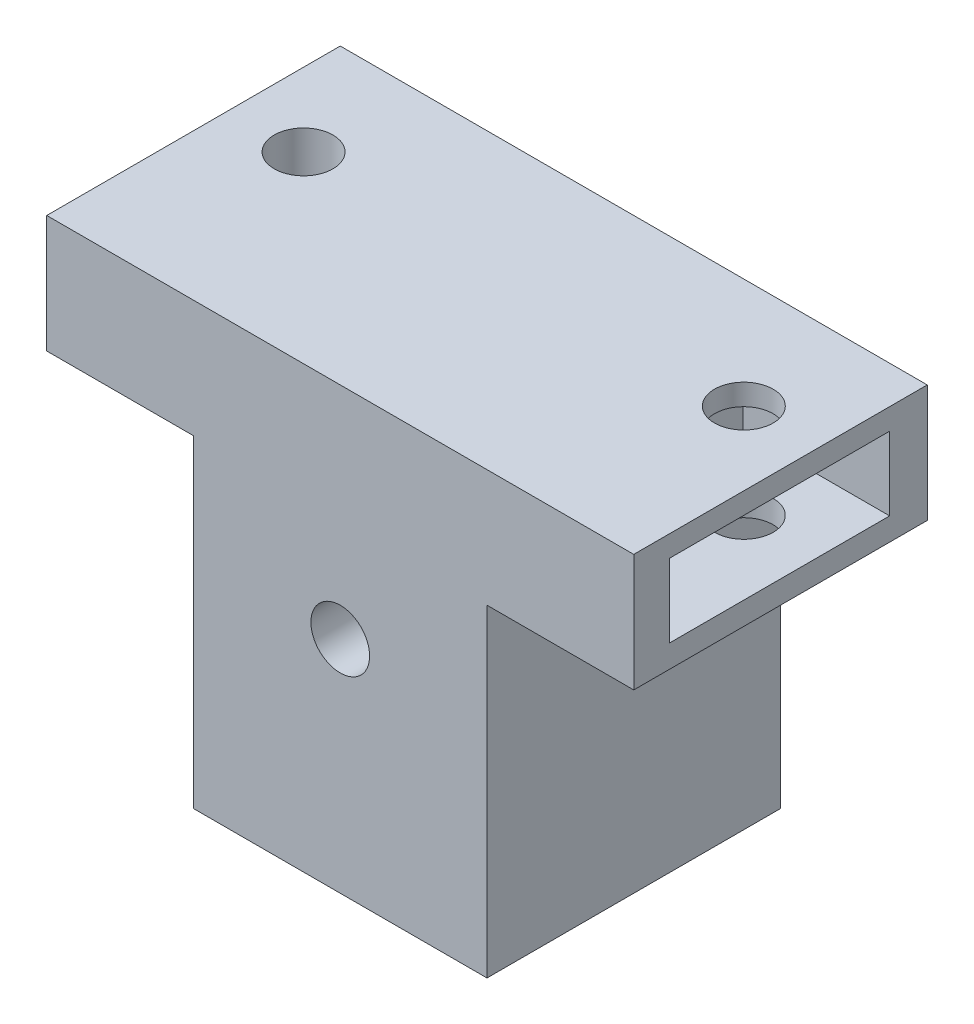
ISO-10303-21;
HEADER;
FILE_DESCRIPTION(('STEP AP214'),'2;1');
FILE_NAME('part.step','',(''),(''),'','','');
FILE_SCHEMA(('AUTOMOTIVE_DESIGN { 1 0 10303 214 1 1 1 1 }'));
ENDSEC;
DATA;
#1=APPLICATION_CONTEXT('core data for automotive mechanical design processes');
#2=APPLICATION_PROTOCOL_DEFINITION('international standard','automotive_design',2000,#1);
#3=PRODUCT_CONTEXT('',#1,'mechanical');
#4=PRODUCT('Part','Part','',(#3));
#5=PRODUCT_RELATED_PRODUCT_CATEGORY('part','',(#4));
#6=PRODUCT_DEFINITION_FORMATION('','',#4);
#7=PRODUCT_DEFINITION_CONTEXT('part definition',#1,'design');
#8=PRODUCT_DEFINITION('design','',#6,#7);
#9=PRODUCT_DEFINITION_SHAPE('','',#8);
#10=(LENGTH_UNIT() NAMED_UNIT(*) SI_UNIT(.MILLI.,.METRE.));
#11=(NAMED_UNIT(*) PLANE_ANGLE_UNIT() SI_UNIT($,.RADIAN.));
#12=(NAMED_UNIT(*) SI_UNIT($,.STERADIAN.) SOLID_ANGLE_UNIT());
#13=UNCERTAINTY_MEASURE_WITH_UNIT(LENGTH_MEASURE(1.E-05),#10,'distance_accuracy_value','');
#14=(GEOMETRIC_REPRESENTATION_CONTEXT(3) GLOBAL_UNCERTAINTY_ASSIGNED_CONTEXT((#13)) GLOBAL_UNIT_ASSIGNED_CONTEXT((#10,
#11,#12)) REPRESENTATION_CONTEXT('',''));
#15=CARTESIAN_POINT('',(0.,0.,0.));
#16=DIRECTION('',(0.,0.,1.));
#17=DIRECTION('',(1.,0.,0.));
#18=AXIS2_PLACEMENT_3D('',#15,#16,#17);
#19=CARTESIAN_POINT('',(15.,5.,7.5));
#20=DIRECTION('',(0.,1.,0.));
#21=DIRECTION('',(0.,0.,1.));
#22=AXIS2_PLACEMENT_3D('',#19,#20,#21);
#23=CYLINDRICAL_SURFACE('',#22,2.);
#24=CARTESIAN_POINT('',(15.,13.5516100939174,7.5));
#25=DIRECTION('',(0.,1.,0.));
#26=DIRECTION('',(0.,0.,1.));
#27=AXIS2_PLACEMENT_3D('',#24,#25,#26);
#28=CIRCLE('',#27,2.);
#29=CARTESIAN_POINT('',(15.,13.5516100939174,9.5));
#30=VERTEX_POINT('',#29);
#31=EDGE_CURVE('E37',#30,#30,#28,.F.);
#32=ORIENTED_EDGE('',*,*,#31,.T.);
#33=EDGE_LOOP('',(#32));
#34=FACE_BOUND('',#33,.T.);
#35=CARTESIAN_POINT('',(15.,15.,7.5));
#36=DIRECTION('',(0.,1.,0.));
#37=DIRECTION('',(0.,0.,1.));
#38=AXIS2_PLACEMENT_3D('',#35,#36,#37);
#39=CIRCLE('',#38,2.);
#40=CARTESIAN_POINT('',(15.,15.,9.5));
#41=VERTEX_POINT('',#40);
#42=EDGE_CURVE('E175',#41,#41,#39,.T.);
#43=ORIENTED_EDGE('',*,*,#42,.T.);
#44=EDGE_LOOP('',(#43));
#45=FACE_BOUND('',#44,.T.);
#46=ADVANCED_FACE('F33',(#34,#45),#23,.F.);
#47=CARTESIAN_POINT('',(10.,-15.,20.));
#48=DIRECTION('',(-1.,0.,0.));
#49=DIRECTION('',(0.,0.,1.));
#50=AXIS2_PLACEMENT_3D('',#47,#48,#49);
#51=PLANE('',#50);
#52=DIRECTION('',(0.,0.,-1.));
#53=VECTOR('',#52,1.);
#54=CARTESIAN_POINT('',(10.,7.,20.));
#55=LINE('',#54,#53);
#56=CARTESIAN_POINT('',(10.,7.,20.));
#57=VERTEX_POINT('',#56);
#58=CARTESIAN_POINT('',(10.,7.,0.));
#59=VERTEX_POINT('',#58);
#60=EDGE_CURVE('E58',#57,#59,#55,.T.);
#61=ORIENTED_EDGE('',*,*,#60,.F.);
#62=DIRECTION('',(0.,1.,0.));
#63=VECTOR('',#62,1.);
#64=CARTESIAN_POINT('',(10.,-15.,20.));
#65=LINE('',#64,#63);
#66=CARTESIAN_POINT('',(10.,-15.,20.));
#67=VERTEX_POINT('',#66);
#68=EDGE_CURVE('E224',#67,#57,#65,.T.);
#69=ORIENTED_EDGE('',*,*,#68,.F.);
#70=DIRECTION('',(0.,0.,-1.));
#71=VECTOR('',#70,1.);
#72=CARTESIAN_POINT('',(10.,-15.,20.));
#73=LINE('',#72,#71);
#74=CARTESIAN_POINT('',(10.,-15.,0.));
#75=VERTEX_POINT('',#74);
#76=EDGE_CURVE('E42',#67,#75,#73,.T.);
#77=ORIENTED_EDGE('',*,*,#76,.T.);
#78=DIRECTION('',(0.,1.,0.));
#79=VECTOR('',#78,1.);
#80=CARTESIAN_POINT('',(10.,-15.,0.));
#81=LINE('',#80,#79);
#82=EDGE_CURVE('E223',#75,#59,#81,.T.);
#83=ORIENTED_EDGE('',*,*,#82,.T.);
#84=EDGE_LOOP('',(#61,#69,#77,#83));
#85=FACE_BOUND('',#84,.T.);
#86=ADVANCED_FACE('F35',(#85),#51,.F.);
#87=CARTESIAN_POINT('',(-10.,-15.,20.));
#88=DIRECTION('',(1.,0.,0.));
#89=DIRECTION('',(0.,0.,-1.));
#90=AXIS2_PLACEMENT_3D('',#87,#88,#89);
#91=PLANE('',#90);
#92=DIRECTION('',(0.,0.,1.));
#93=VECTOR('',#92,1.);
#94=CARTESIAN_POINT('',(-10.,7.,0.));
#95=LINE('',#94,#93);
#96=CARTESIAN_POINT('',(-10.,7.,0.));
#97=VERTEX_POINT('',#96);
#98=CARTESIAN_POINT('',(-10.,7.,20.));
#99=VERTEX_POINT('',#98);
#100=EDGE_CURVE('E203',#97,#99,#95,.T.);
#101=ORIENTED_EDGE('',*,*,#100,.F.);
#102=DIRECTION('',(0.,-1.,0.));
#103=VECTOR('',#102,1.);
#104=CARTESIAN_POINT('',(-10.,-15.,0.));
#105=LINE('',#104,#103);
#106=CARTESIAN_POINT('',(-10.,-15.,0.));
#107=VERTEX_POINT('',#106);
#108=EDGE_CURVE('E236',#97,#107,#105,.T.);
#109=ORIENTED_EDGE('',*,*,#108,.T.);
#110=DIRECTION('',(0.,0.,-1.));
#111=VECTOR('',#110,1.);
#112=CARTESIAN_POINT('',(-10.,-15.,20.));
#113=LINE('',#112,#111);
#114=CARTESIAN_POINT('',(-10.,-15.,20.));
#115=VERTEX_POINT('',#114);
#116=EDGE_CURVE('E11',#115,#107,#113,.T.);
#117=ORIENTED_EDGE('',*,*,#116,.F.);
#118=DIRECTION('',(0.,-1.,0.));
#119=VECTOR('',#118,1.);
#120=CARTESIAN_POINT('',(-10.,-15.,20.));
#121=LINE('',#120,#119);
#122=EDGE_CURVE('E229',#99,#115,#121,.T.);
#123=ORIENTED_EDGE('',*,*,#122,.F.);
#124=EDGE_LOOP('',(#101,#109,#117,#123));
#125=FACE_BOUND('',#124,.T.);
#126=ADVANCED_FACE('F273',(#125),#91,.F.);
#127=CARTESIAN_POINT('',(-10.,15.,20.));
#128=DIRECTION('',(0.,-1.,0.));
#129=DIRECTION('',(0.,0.,-1.));
#130=AXIS2_PLACEMENT_3D('',#127,#128,#129);
#131=PLANE('',#130);
#132=ORIENTED_EDGE('',*,*,#42,.F.);
#133=EDGE_LOOP('',(#132));
#134=FACE_BOUND('',#133,.T.);
#135=CARTESIAN_POINT('',(-15.,15.,7.5));
#136=DIRECTION('',(0.,1.,0.));
#137=DIRECTION('',(0.,0.,1.));
#138=AXIS2_PLACEMENT_3D('',#135,#136,#137);
#139=CIRCLE('',#138,2.);
#140=CARTESIAN_POINT('',(-15.,15.,9.5));
#141=VERTEX_POINT('',#140);
#142=EDGE_CURVE('E181',#141,#141,#139,.T.);
#143=ORIENTED_EDGE('',*,*,#142,.F.);
#144=EDGE_LOOP('',(#143));
#145=FACE_BOUND('',#144,.T.);
#146=DIRECTION('',(-1.,0.,0.));
#147=VECTOR('',#146,1.);
#148=CARTESIAN_POINT('',(-10.,15.,0.));
#149=LINE('',#148,#147);
#150=CARTESIAN_POINT('',(20.,15.,0.));
#151=VERTEX_POINT('',#150);
#152=CARTESIAN_POINT('',(-20.,15.,0.));
#153=VERTEX_POINT('',#152);
#154=EDGE_CURVE('E234',#151,#153,#149,.T.);
#155=ORIENTED_EDGE('',*,*,#154,.T.);
#156=DIRECTION('',(0.,0.,-1.));
#157=VECTOR('',#156,1.);
#158=CARTESIAN_POINT('',(-20.,15.,0.));
#159=LINE('',#158,#157);
#160=CARTESIAN_POINT('',(-20.,15.,20.));
#161=VERTEX_POINT('',#160);
#162=EDGE_CURVE('E212',#161,#153,#159,.T.);
#163=ORIENTED_EDGE('',*,*,#162,.F.);
#164=DIRECTION('',(-1.,0.,0.));
#165=VECTOR('',#164,1.);
#166=CARTESIAN_POINT('',(-10.,15.,20.));
#167=LINE('',#166,#165);
#168=CARTESIAN_POINT('',(20.,15.,20.));
#169=VERTEX_POINT('',#168);
#170=EDGE_CURVE('E226',#169,#161,#167,.T.);
#171=ORIENTED_EDGE('',*,*,#170,.F.);
#172=DIRECTION('',(0.,0.,1.));
#173=VECTOR('',#172,1.);
#174=CARTESIAN_POINT('',(20.,15.,20.));
#175=LINE('',#174,#173);
#176=EDGE_CURVE('E193',#151,#169,#175,.T.);
#177=ORIENTED_EDGE('',*,*,#176,.F.);
#178=EDGE_LOOP('',(#155,#163,#171,#177));
#179=FACE_BOUND('',#178,.T.);
#180=ADVANCED_FACE('F306',(#134,#145,#179),#131,.F.);
#181=CARTESIAN_POINT('',(-10.,-15.,20.));
#182=DIRECTION('',(0.,1.,0.));
#183=DIRECTION('',(0.,0.,1.));
#184=AXIS2_PLACEMENT_3D('',#181,#182,#183);
#185=PLANE('',#184);
#186=DIRECTION('',(1.,0.,0.));
#187=VECTOR('',#186,1.);
#188=CARTESIAN_POINT('',(-10.,-15.,0.));
#189=LINE('',#188,#187);
#190=EDGE_CURVE('E227',#107,#75,#189,.T.);
#191=ORIENTED_EDGE('',*,*,#190,.T.);
#192=ORIENTED_EDGE('',*,*,#76,.F.);
#193=DIRECTION('',(1.,0.,0.));
#194=VECTOR('',#193,1.);
#195=CARTESIAN_POINT('',(-10.,-15.,20.));
#196=LINE('',#195,#194);
#197=EDGE_CURVE('E231',#115,#67,#196,.T.);
#198=ORIENTED_EDGE('',*,*,#197,.F.);
#199=ORIENTED_EDGE('',*,*,#116,.T.);
#200=EDGE_LOOP('',(#191,#192,#198,#199));
#201=FACE_BOUND('',#200,.T.);
#202=ADVANCED_FACE('F322',(#201),#185,.F.);
#203=CARTESIAN_POINT('',(0.,0.,20.));
#204=DIRECTION('',(0.,0.,-1.));
#205=DIRECTION('',(-1.,0.,0.));
#206=AXIS2_PLACEMENT_3D('',#203,#204,#205);
#207=PLANE('',#206);
#208=CARTESIAN_POINT('',(0.,0.,20.));
#209=DIRECTION('',(0.,0.,-1.));
#210=DIRECTION('',(-1.,0.,0.));
#211=AXIS2_PLACEMENT_3D('',#208,#209,#210);
#212=CIRCLE('',#211,2.);
#213=CARTESIAN_POINT('',(-2.,0.,20.));
#214=VERTEX_POINT('',#213);
#215=EDGE_CURVE('E165',#214,#214,#212,.T.);
#216=ORIENTED_EDGE('',*,*,#215,.T.);
#217=EDGE_LOOP('',(#216));
#218=FACE_BOUND('',#217,.T.);
#219=ORIENTED_EDGE('',*,*,#68,.T.);
#220=DIRECTION('',(-1.,0.,0.));
#221=VECTOR('',#220,1.);
#222=CARTESIAN_POINT('',(20.,7.,20.));
#223=LINE('',#222,#221);
#224=CARTESIAN_POINT('',(20.,7.,20.));
#225=VERTEX_POINT('',#224);
#226=EDGE_CURVE('E200',#225,#57,#223,.T.);
#227=ORIENTED_EDGE('',*,*,#226,.F.);
#228=DIRECTION('',(0.,-1.,0.));
#229=VECTOR('',#228,1.);
#230=CARTESIAN_POINT('',(20.,15.,20.));
#231=LINE('',#230,#229);
#232=EDGE_CURVE('E185',#169,#225,#231,.T.);
#233=ORIENTED_EDGE('',*,*,#232,.F.);
#234=ORIENTED_EDGE('',*,*,#170,.T.);
#235=DIRECTION('',(0.,1.,0.));
#236=VECTOR('',#235,1.);
#237=CARTESIAN_POINT('',(-20.,15.,20.));
#238=LINE('',#237,#236);
#239=CARTESIAN_POINT('',(-20.,7.,20.));
#240=VERTEX_POINT('',#239);
#241=EDGE_CURVE('E209',#240,#161,#238,.T.);
#242=ORIENTED_EDGE('',*,*,#241,.F.);
#243=DIRECTION('',(1.,0.,0.));
#244=VECTOR('',#243,1.);
#245=CARTESIAN_POINT('',(-20.,7.,20.));
#246=LINE('',#245,#244);
#247=EDGE_CURVE('E215',#240,#99,#246,.T.);
#248=ORIENTED_EDGE('',*,*,#247,.T.);
#249=ORIENTED_EDGE('',*,*,#122,.T.);
#250=ORIENTED_EDGE('',*,*,#197,.T.);
#251=EDGE_LOOP('',(#219,#227,#233,#234,#242,#248,#249,#250));
#252=FACE_BOUND('',#251,.T.);
#253=ADVANCED_FACE('F310',(#218,#252),#207,.F.);
#254=CARTESIAN_POINT('',(0.,0.,0.));
#255=DIRECTION('',(0.,0.,-1.));
#256=DIRECTION('',(-1.,0.,0.));
#257=AXIS2_PLACEMENT_3D('',#254,#255,#256);
#258=PLANE('',#257);
#259=CARTESIAN_POINT('',(0.,1.29676584788285,0.));
#260=DIRECTION('',(0.,0.,-1.));
#261=DIRECTION('',(-1.,0.,0.));
#262=AXIS2_PLACEMENT_3D('',#259,#260,#261);
#263=CIRCLE('',#262,6.);
#264=CARTESIAN_POINT('',(-6.,1.29676584788285,0.));
#265=VERTEX_POINT('',#264);
#266=EDGE_CURVE('E168',#265,#265,#263,.T.);
#267=ORIENTED_EDGE('',*,*,#266,.F.);
#268=EDGE_LOOP('',(#267));
#269=FACE_BOUND('',#268,.T.);
#270=ORIENTED_EDGE('',*,*,#82,.F.);
#271=ORIENTED_EDGE('',*,*,#190,.F.);
#272=ORIENTED_EDGE('',*,*,#108,.F.);
#273=DIRECTION('',(1.,0.,0.));
#274=VECTOR('',#273,1.);
#275=CARTESIAN_POINT('',(-20.,7.,0.));
#276=LINE('',#275,#274);
#277=CARTESIAN_POINT('',(-20.,7.,0.));
#278=VERTEX_POINT('',#277);
#279=EDGE_CURVE('E220',#278,#97,#276,.T.);
#280=ORIENTED_EDGE('',*,*,#279,.F.);
#281=DIRECTION('',(0.,-1.,0.));
#282=VECTOR('',#281,1.);
#283=CARTESIAN_POINT('',(-20.,15.,0.));
#284=LINE('',#283,#282);
#285=EDGE_CURVE('E204',#153,#278,#284,.T.);
#286=ORIENTED_EDGE('',*,*,#285,.F.);
#287=ORIENTED_EDGE('',*,*,#154,.F.);
#288=DIRECTION('',(0.,1.,0.));
#289=VECTOR('',#288,1.);
#290=CARTESIAN_POINT('',(20.,15.,0.));
#291=LINE('',#290,#289);
#292=CARTESIAN_POINT('',(20.,7.,0.));
#293=VERTEX_POINT('',#292);
#294=EDGE_CURVE('E190',#293,#151,#291,.T.);
#295=ORIENTED_EDGE('',*,*,#294,.F.);
#296=DIRECTION('',(-1.,0.,0.));
#297=VECTOR('',#296,1.);
#298=CARTESIAN_POINT('',(20.,7.,0.));
#299=LINE('',#298,#297);
#300=EDGE_CURVE('E196',#293,#59,#299,.T.);
#301=ORIENTED_EDGE('',*,*,#300,.T.);
#302=EDGE_LOOP('',(#270,#271,#272,#280,#286,#287,#295,#301));
#303=FACE_BOUND('',#302,.T.);
#304=ADVANCED_FACE('F299',(#269,#303),#258,.T.);
#305=CARTESIAN_POINT('',(-20.,7.,0.));
#306=DIRECTION('',(0.,1.,0.));
#307=DIRECTION('',(0.,0.,1.));
#308=AXIS2_PLACEMENT_3D('',#305,#306,#307);
#309=PLANE('',#308);
#310=CARTESIAN_POINT('',(-15.,7.,7.5));
#311=DIRECTION('',(0.,1.,0.));
#312=DIRECTION('',(0.,0.,1.));
#313=AXIS2_PLACEMENT_3D('',#310,#311,#312);
#314=CIRCLE('',#313,2.);
#315=CARTESIAN_POINT('',(-15.,7.,9.5));
#316=VERTEX_POINT('',#315);
#317=EDGE_CURVE('E184',#316,#316,#314,.T.);
#318=ORIENTED_EDGE('',*,*,#317,.T.);
#319=EDGE_LOOP('',(#318));
#320=FACE_BOUND('',#319,.T.);
#321=ORIENTED_EDGE('',*,*,#100,.T.);
#322=ORIENTED_EDGE('',*,*,#247,.F.);
#323=DIRECTION('',(0.,0.,1.));
#324=VECTOR('',#323,1.);
#325=CARTESIAN_POINT('',(-20.,7.,0.));
#326=LINE('',#325,#324);
#327=EDGE_CURVE('E207',#278,#240,#326,.T.);
#328=ORIENTED_EDGE('',*,*,#327,.F.);
#329=ORIENTED_EDGE('',*,*,#279,.T.);
#330=EDGE_LOOP('',(#321,#322,#328,#329));
#331=FACE_BOUND('',#330,.T.);
#332=ADVANCED_FACE('F315',(#320,#331),#309,.F.);
#333=CARTESIAN_POINT('',(-20.,0.,0.));
#334=DIRECTION('',(-1.,0.,0.));
#335=DIRECTION('',(0.,0.,1.));
#336=AXIS2_PLACEMENT_3D('',#333,#334,#335);
#337=PLANE('',#336);
#338=ORIENTED_EDGE('',*,*,#285,.T.);
#339=ORIENTED_EDGE('',*,*,#327,.T.);
#340=ORIENTED_EDGE('',*,*,#241,.T.);
#341=ORIENTED_EDGE('',*,*,#162,.T.);
#342=EDGE_LOOP('',(#338,#339,#340,#341));
#343=FACE_BOUND('',#342,.T.);
#344=ADVANCED_FACE('F292',(#343),#337,.T.);
#345=CARTESIAN_POINT('',(20.,7.,20.));
#346=DIRECTION('',(0.,1.,0.));
#347=DIRECTION('',(0.,0.,1.));
#348=AXIS2_PLACEMENT_3D('',#345,#346,#347);
#349=PLANE('',#348);
#350=CARTESIAN_POINT('',(15.,7.,7.5));
#351=DIRECTION('',(0.,1.,0.));
#352=DIRECTION('',(0.,0.,1.));
#353=AXIS2_PLACEMENT_3D('',#350,#351,#352);
#354=CIRCLE('',#353,2.);
#355=CARTESIAN_POINT('',(15.,7.,9.5));
#356=VERTEX_POINT('',#355);
#357=EDGE_CURVE('E180',#356,#356,#354,.T.);
#358=ORIENTED_EDGE('',*,*,#357,.T.);
#359=EDGE_LOOP('',(#358));
#360=FACE_BOUND('',#359,.T.);
#361=ORIENTED_EDGE('',*,*,#60,.T.);
#362=ORIENTED_EDGE('',*,*,#300,.F.);
#363=DIRECTION('',(0.,0.,-1.));
#364=VECTOR('',#363,1.);
#365=CARTESIAN_POINT('',(20.,7.,20.));
#366=LINE('',#365,#364);
#367=EDGE_CURVE('E188',#225,#293,#366,.T.);
#368=ORIENTED_EDGE('',*,*,#367,.F.);
#369=ORIENTED_EDGE('',*,*,#226,.T.);
#370=EDGE_LOOP('',(#361,#362,#368,#369));
#371=FACE_BOUND('',#370,.T.);
#372=ADVANCED_FACE('F289',(#360,#371),#349,.F.);
#373=CARTESIAN_POINT('',(20.,0.,0.));
#374=DIRECTION('',(1.,0.,0.));
#375=DIRECTION('',(0.,0.,-1.));
#376=AXIS2_PLACEMENT_3D('',#373,#374,#375);
#377=PLANE('',#376);
#378=DIRECTION('',(0.,-1.,0.));
#379=VECTOR('',#378,1.);
#380=CARTESIAN_POINT('',(20.,13.5516100939174,17.5635147809228));
#381=LINE('',#380,#379);
#382=CARTESIAN_POINT('',(20.,13.5516100939174,17.5635147809228));
#383=VERTEX_POINT('',#382);
#384=CARTESIAN_POINT('',(20.,8.55161009391736,17.5635147809228));
#385=VERTEX_POINT('',#384);
#386=EDGE_CURVE('E50',#383,#385,#381,.T.);
#387=ORIENTED_EDGE('',*,*,#386,.F.);
#388=DIRECTION('',(0.,0.,1.));
#389=VECTOR('',#388,1.);
#390=CARTESIAN_POINT('',(20.,13.5516100939174,2.56351478092277));
#391=LINE('',#390,#389);
#392=CARTESIAN_POINT('',(20.,13.5516100939174,2.56351478092277));
#393=VERTEX_POINT('',#392);
#394=EDGE_CURVE('E146',#393,#383,#391,.T.);
#395=ORIENTED_EDGE('',*,*,#394,.F.);
#396=DIRECTION('',(0.,1.,0.));
#397=VECTOR('',#396,1.);
#398=CARTESIAN_POINT('',(20.,13.5516100939174,2.56351478092277));
#399=LINE('',#398,#397);
#400=CARTESIAN_POINT('',(20.,8.55161009391736,2.56351478092277));
#401=VERTEX_POINT('',#400);
#402=EDGE_CURVE('E149',#401,#393,#399,.T.);
#403=ORIENTED_EDGE('',*,*,#402,.F.);
#404=DIRECTION('',(0.,0.,-1.));
#405=VECTOR('',#404,1.);
#406=CARTESIAN_POINT('',(20.,8.55161009391736,2.56351478092277));
#407=LINE('',#406,#405);
#408=EDGE_CURVE('E155',#385,#401,#407,.T.);
#409=ORIENTED_EDGE('',*,*,#408,.F.);
#410=EDGE_LOOP('',(#387,#395,#403,#409));
#411=FACE_BOUND('',#410,.T.);
#412=ORIENTED_EDGE('',*,*,#232,.T.);
#413=ORIENTED_EDGE('',*,*,#367,.T.);
#414=ORIENTED_EDGE('',*,*,#294,.T.);
#415=ORIENTED_EDGE('',*,*,#176,.T.);
#416=EDGE_LOOP('',(#412,#413,#414,#415));
#417=FACE_BOUND('',#416,.T.);
#418=ADVANCED_FACE('F284',(#411,#417),#377,.T.);
#419=CARTESIAN_POINT('',(-15.,5.,7.5));
#420=DIRECTION('',(0.,1.,0.));
#421=DIRECTION('',(0.,0.,1.));
#422=AXIS2_PLACEMENT_3D('',#419,#420,#421);
#423=CYLINDRICAL_SURFACE('',#422,2.);
#424=ORIENTED_EDGE('',*,*,#142,.T.);
#425=EDGE_LOOP('',(#424));
#426=FACE_BOUND('',#425,.T.);
#427=ORIENTED_EDGE('',*,*,#317,.F.);
#428=EDGE_LOOP('',(#427));
#429=FACE_BOUND('',#428,.T.);
#430=ADVANCED_FACE('F278',(#426,#429),#423,.F.);
#431=CARTESIAN_POINT('',(15.,8.55161009391736,7.5));
#432=DIRECTION('',(0.,-1.,0.));
#433=DIRECTION('',(0.,0.,-1.));
#434=AXIS2_PLACEMENT_3D('',#431,#432,#433);
#435=CIRCLE('',#434,2.);
#436=CARTESIAN_POINT('',(15.,8.55161009391736,5.5));
#437=VERTEX_POINT('',#436);
#438=EDGE_CURVE('E161',#437,#437,#435,.F.);
#439=ORIENTED_EDGE('',*,*,#438,.T.);
#440=EDGE_LOOP('',(#439));
#441=FACE_BOUND('',#440,.T.);
#442=ORIENTED_EDGE('',*,*,#357,.F.);
#443=EDGE_LOOP('',(#442));
#444=FACE_BOUND('',#443,.T.);
#445=ADVANCED_FACE('F269',(#441,#444),#23,.F.);
#446=CARTESIAN_POINT('',(0.,1.29676584788285,10.));
#447=DIRECTION('',(0.,0.,-1.));
#448=DIRECTION('',(-1.,0.,0.));
#449=AXIS2_PLACEMENT_3D('',#446,#447,#448);
#450=CYLINDRICAL_SURFACE('',#449,6.);
#451=CARTESIAN_POINT('',(0.,1.29676584788285,10.));
#452=DIRECTION('',(0.,0.,-1.));
#453=DIRECTION('',(-1.,0.,0.));
#454=AXIS2_PLACEMENT_3D('',#451,#452,#453);
#455=CIRCLE('',#454,6.);
#456=CARTESIAN_POINT('',(-6.,1.29676584788285,10.));
#457=VERTEX_POINT('',#456);
#458=EDGE_CURVE('E172',#457,#457,#455,.T.);
#459=ORIENTED_EDGE('',*,*,#458,.F.);
#460=EDGE_LOOP('',(#459));
#461=FACE_BOUND('',#460,.T.);
#462=ORIENTED_EDGE('',*,*,#266,.T.);
#463=EDGE_LOOP('',(#462));
#464=FACE_BOUND('',#463,.T.);
#465=ADVANCED_FACE('F277',(#461,#464),#450,.F.);
#466=CARTESIAN_POINT('',(0.,1.29676584788285,10.));
#467=DIRECTION('',(0.,0.,-1.));
#468=DIRECTION('',(-1.,0.,0.));
#469=AXIS2_PLACEMENT_3D('',#466,#467,#468);
#470=PLANE('',#469);
#471=CARTESIAN_POINT('',(0.,0.,10.));
#472=DIRECTION('',(0.,0.,-1.));
#473=DIRECTION('',(-1.,0.,0.));
#474=AXIS2_PLACEMENT_3D('',#471,#472,#473);
#475=CIRCLE('',#474,2.);
#476=CARTESIAN_POINT('',(-2.,0.,10.));
#477=VERTEX_POINT('',#476);
#478=EDGE_CURVE('E169',#477,#477,#475,.T.);
#479=ORIENTED_EDGE('',*,*,#478,.F.);
#480=EDGE_LOOP('',(#479));
#481=FACE_BOUND('',#480,.T.);
#482=ORIENTED_EDGE('',*,*,#458,.T.);
#483=EDGE_LOOP('',(#482));
#484=FACE_BOUND('',#483,.T.);
#485=ADVANCED_FACE('F262',(#481,#484),#470,.T.);
#486=CARTESIAN_POINT('',(0.,0.,20.));
#487=DIRECTION('',(0.,0.,-1.));
#488=DIRECTION('',(-1.,0.,0.));
#489=AXIS2_PLACEMENT_3D('',#486,#487,#488);
#490=CYLINDRICAL_SURFACE('',#489,2.);
#491=ORIENTED_EDGE('',*,*,#215,.F.);
#492=EDGE_LOOP('',(#491));
#493=FACE_BOUND('',#492,.T.);
#494=ORIENTED_EDGE('',*,*,#478,.T.);
#495=EDGE_LOOP('',(#494));
#496=FACE_BOUND('',#495,.T.);
#497=ADVANCED_FACE('F254',(#493,#496),#490,.F.);
#498=CARTESIAN_POINT('',(10.,13.5516100939174,2.56351478092277));
#499=DIRECTION('',(0.,1.,0.));
#500=DIRECTION('',(0.,0.,1.));
#501=AXIS2_PLACEMENT_3D('',#498,#499,#500);
#502=PLANE('',#501);
#503=ORIENTED_EDGE('',*,*,#394,.T.);
#504=DIRECTION('',(1.,0.,0.));
#505=VECTOR('',#504,1.);
#506=CARTESIAN_POINT('',(10.,13.5516100939174,17.5635147809228));
#507=LINE('',#506,#505);
#508=CARTESIAN_POINT('',(10.,13.5516100939174,17.5635147809228));
#509=VERTEX_POINT('',#508);
#510=EDGE_CURVE('E159',#509,#383,#507,.T.);
#511=ORIENTED_EDGE('',*,*,#510,.F.);
#512=DIRECTION('',(0.,0.,1.));
#513=VECTOR('',#512,1.);
#514=CARTESIAN_POINT('',(10.,13.5516100939174,2.56351478092277));
#515=LINE('',#514,#513);
#516=CARTESIAN_POINT('',(10.,13.5516100939174,2.56351478092277));
#517=VERTEX_POINT('',#516);
#518=EDGE_CURVE('E133',#517,#509,#515,.T.);
#519=ORIENTED_EDGE('',*,*,#518,.F.);
#520=DIRECTION('',(1.,0.,0.));
#521=VECTOR('',#520,1.);
#522=CARTESIAN_POINT('',(10.,13.5516100939174,2.56351478092277));
#523=LINE('',#522,#521);
#524=EDGE_CURVE('E162',#517,#393,#523,.T.);
#525=ORIENTED_EDGE('',*,*,#524,.T.);
#526=EDGE_LOOP('',(#503,#511,#519,#525));
#527=FACE_BOUND('',#526,.T.);
#528=ORIENTED_EDGE('',*,*,#31,.F.);
#529=EDGE_LOOP('',(#528));
#530=FACE_BOUND('',#529,.T.);
#531=ADVANCED_FACE('F252',(#527,#530),#502,.F.);
#532=CARTESIAN_POINT('',(10.,8.55161009391736,2.56351478092277));
#533=DIRECTION('',(0.,-1.,0.));
#534=DIRECTION('',(0.,0.,-1.));
#535=AXIS2_PLACEMENT_3D('',#532,#533,#534);
#536=PLANE('',#535);
#537=ORIENTED_EDGE('',*,*,#408,.T.);
#538=DIRECTION('',(1.,0.,0.));
#539=VECTOR('',#538,1.);
#540=CARTESIAN_POINT('',(10.,8.55161009391736,2.56351478092277));
#541=LINE('',#540,#539);
#542=CARTESIAN_POINT('',(10.,8.55161009391736,2.56351478092277));
#543=VERTEX_POINT('',#542);
#544=EDGE_CURVE('E132',#543,#401,#541,.T.);
#545=ORIENTED_EDGE('',*,*,#544,.F.);
#546=DIRECTION('',(0.,0.,-1.));
#547=VECTOR('',#546,1.);
#548=CARTESIAN_POINT('',(10.,8.55161009391736,2.56351478092277));
#549=LINE('',#548,#547);
#550=CARTESIAN_POINT('',(10.,8.55161009391736,17.5635147809228));
#551=VERTEX_POINT('',#550);
#552=EDGE_CURVE('E136',#551,#543,#549,.T.);
#553=ORIENTED_EDGE('',*,*,#552,.F.);
#554=DIRECTION('',(1.,0.,0.));
#555=VECTOR('',#554,1.);
#556=CARTESIAN_POINT('',(10.,8.55161009391736,17.5635147809228));
#557=LINE('',#556,#555);
#558=EDGE_CURVE('E123',#551,#385,#557,.T.);
#559=ORIENTED_EDGE('',*,*,#558,.T.);
#560=EDGE_LOOP('',(#537,#545,#553,#559));
#561=FACE_BOUND('',#560,.T.);
#562=ORIENTED_EDGE('',*,*,#438,.F.);
#563=EDGE_LOOP('',(#562));
#564=FACE_BOUND('',#563,.T.);
#565=ADVANCED_FACE('F137',(#561,#564),#536,.F.);
#566=CARTESIAN_POINT('',(10.,13.5516100939174,17.5635147809228));
#567=DIRECTION('',(0.,0.,1.));
#568=DIRECTION('',(1.,0.,0.));
#569=AXIS2_PLACEMENT_3D('',#566,#567,#568);
#570=PLANE('',#569);
#571=ORIENTED_EDGE('',*,*,#386,.T.);
#572=ORIENTED_EDGE('',*,*,#558,.F.);
#573=DIRECTION('',(0.,-1.,0.));
#574=VECTOR('',#573,1.);
#575=CARTESIAN_POINT('',(10.,13.5516100939174,17.5635147809228));
#576=LINE('',#575,#574);
#577=EDGE_CURVE('E127',#509,#551,#576,.T.);
#578=ORIENTED_EDGE('',*,*,#577,.F.);
#579=ORIENTED_EDGE('',*,*,#510,.T.);
#580=EDGE_LOOP('',(#571,#572,#578,#579));
#581=FACE_BOUND('',#580,.T.);
#582=ADVANCED_FACE('F125',(#581),#570,.F.);
#583=CARTESIAN_POINT('',(10.,13.5516100939174,2.56351478092277));
#584=DIRECTION('',(0.,0.,-1.));
#585=DIRECTION('',(0.,1.,0.));
#586=AXIS2_PLACEMENT_3D('',#583,#584,#585);
#587=PLANE('',#586);
#588=ORIENTED_EDGE('',*,*,#402,.T.);
#589=ORIENTED_EDGE('',*,*,#524,.F.);
#590=DIRECTION('',(0.,1.,0.));
#591=VECTOR('',#590,1.);
#592=CARTESIAN_POINT('',(10.,13.5516100939174,2.56351478092277));
#593=LINE('',#592,#591);
#594=EDGE_CURVE('E142',#543,#517,#593,.T.);
#595=ORIENTED_EDGE('',*,*,#594,.F.);
#596=ORIENTED_EDGE('',*,*,#544,.T.);
#597=EDGE_LOOP('',(#588,#589,#595,#596));
#598=FACE_BOUND('',#597,.T.);
#599=ADVANCED_FACE('F443',(#598),#587,.F.);
#600=CARTESIAN_POINT('',(10.,0.,0.));
#601=DIRECTION('',(-1.,0.,0.));
#602=DIRECTION('',(0.,0.,1.));
#603=AXIS2_PLACEMENT_3D('',#600,#601,#602);
#604=PLANE('',#603);
#605=ORIENTED_EDGE('',*,*,#577,.T.);
#606=ORIENTED_EDGE('',*,*,#552,.T.);
#607=ORIENTED_EDGE('',*,*,#594,.T.);
#608=ORIENTED_EDGE('',*,*,#518,.T.);
#609=EDGE_LOOP('',(#605,#606,#607,#608));
#610=FACE_BOUND('',#609,.T.);
#611=ADVANCED_FACE('F144',(#610),#604,.F.);
#612=CLOSED_SHELL('',(#46,#86,#126,#180,#202,#253,#304,#332,#344,#372,#418,#430,#445,#465,#485,
#497,#531,#565,#582,#599,#611));
#613=MANIFOLD_SOLID_BREP('B2',#612);
#614=ADVANCED_BREP_SHAPE_REPRESENTATION('',(#18,#613),#14);
#615=SHAPE_DEFINITION_REPRESENTATION(#9,#614);
ENDSEC;
END-ISO-10303-21;
